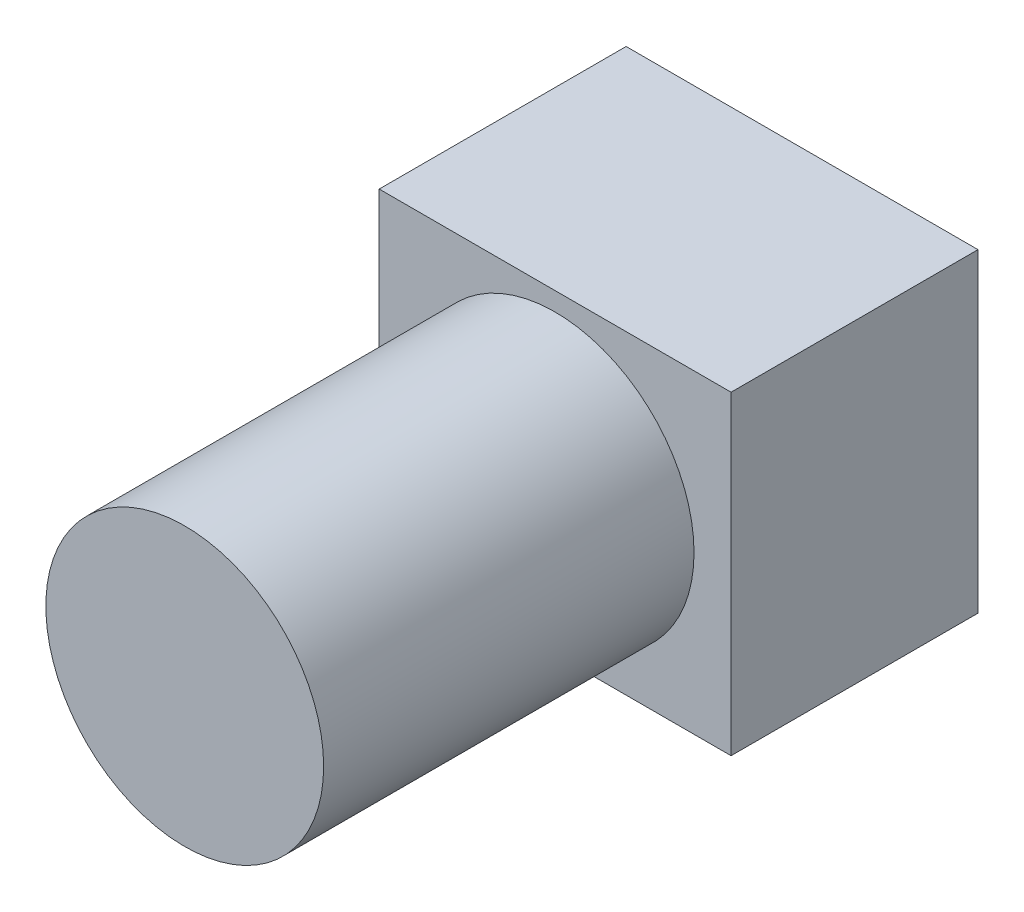
ISO-10303-21;
HEADER;
FILE_DESCRIPTION(('STEP AP214'),'2;1');
FILE_NAME('part.step','',(''),(''),'','','');
FILE_SCHEMA(('AUTOMOTIVE_DESIGN { 1 0 10303 214 1 1 1 1 }'));
ENDSEC;
DATA;
#1=APPLICATION_CONTEXT('core data for automotive mechanical design processes');
#2=APPLICATION_PROTOCOL_DEFINITION('international standard','automotive_design',2000,#1);
#3=PRODUCT_CONTEXT('',#1,'mechanical');
#4=PRODUCT('Part','Part','',(#3));
#5=PRODUCT_RELATED_PRODUCT_CATEGORY('part','',(#4));
#6=PRODUCT_DEFINITION_FORMATION('','',#4);
#7=PRODUCT_DEFINITION_CONTEXT('part definition',#1,'design');
#8=PRODUCT_DEFINITION('design','',#6,#7);
#9=PRODUCT_DEFINITION_SHAPE('','',#8);
#10=(LENGTH_UNIT() NAMED_UNIT(*) SI_UNIT(.MILLI.,.METRE.));
#11=(NAMED_UNIT(*) PLANE_ANGLE_UNIT() SI_UNIT($,.RADIAN.));
#12=(NAMED_UNIT(*) SI_UNIT($,.STERADIAN.) SOLID_ANGLE_UNIT());
#13=UNCERTAINTY_MEASURE_WITH_UNIT(LENGTH_MEASURE(1.E-05),#10,'distance_accuracy_value','');
#14=(GEOMETRIC_REPRESENTATION_CONTEXT(3) GLOBAL_UNCERTAINTY_ASSIGNED_CONTEXT((#13)) GLOBAL_UNIT_ASSIGNED_CONTEXT((#10,
#11,#12)) REPRESENTATION_CONTEXT('',''));
#15=CARTESIAN_POINT('',(0.,0.,0.));
#16=DIRECTION('',(0.,0.,1.));
#17=DIRECTION('',(1.,0.,0.));
#18=AXIS2_PLACEMENT_3D('',#15,#16,#17);
#19=CARTESIAN_POINT('',(0.458787901583167,39.7940471189003,122.003262529889));
#20=DIRECTION('',(-1.,0.,0.));
#21=DIRECTION('',(0.,-1.,0.));
#22=AXIS2_PLACEMENT_3D('',#19,#20,#21);
#23=PLANE('',#22);
#24=DIRECTION('',(0.,-1.,0.));
#25=VECTOR('',#24,1.);
#26=CARTESIAN_POINT('',(0.458787901583167,39.7940471189003,126.003262529889));
#27=LINE('',#26,#25);
#28=CARTESIAN_POINT('',(0.458787901583167,39.7940471189003,126.003262529889));
#29=VERTEX_POINT('',#28);
#30=CARTESIAN_POINT('',(0.458787901583167,34.6940472208443,126.003262529889));
#31=VERTEX_POINT('',#30);
#32=EDGE_CURVE('E146',#29,#31,#27,.T.);
#33=ORIENTED_EDGE('',*,*,#32,.T.);
#34=DIRECTION('',(0.,0.,1.));
#35=VECTOR('',#34,1.);
#36=CARTESIAN_POINT('',(0.458787901583167,34.6940472208443,122.003262529889));
#37=LINE('',#36,#35);
#38=CARTESIAN_POINT('',(0.458787901583167,34.6940472208443,122.003262529889));
#39=VERTEX_POINT('',#38);
#40=EDGE_CURVE('E37',#39,#31,#37,.T.);
#41=ORIENTED_EDGE('',*,*,#40,.F.);
#42=DIRECTION('',(0.,-1.,0.));
#43=VECTOR('',#42,1.);
#44=CARTESIAN_POINT('',(0.458787901583167,39.7940471189003,122.003262529889));
#45=LINE('',#44,#43);
#46=CARTESIAN_POINT('',(0.458787901583167,39.7940471189003,122.003262529889));
#47=VERTEX_POINT('',#46);
#48=EDGE_CURVE('E150',#47,#39,#45,.T.);
#49=ORIENTED_EDGE('',*,*,#48,.F.);
#50=DIRECTION('',(0.,0.,1.));
#51=VECTOR('',#50,1.);
#52=CARTESIAN_POINT('',(0.458787901583167,39.7940471189003,122.003262529889));
#53=LINE('',#52,#51);
#54=EDGE_CURVE('E156',#47,#29,#53,.T.);
#55=ORIENTED_EDGE('',*,*,#54,.T.);
#56=EDGE_LOOP('',(#33,#41,#49,#55));
#57=FACE_BOUND('',#56,.T.);
#58=ADVANCED_FACE('F34',(#57),#23,.F.);
#59=CARTESIAN_POINT('',(0.458787901583167,34.6940472208443,122.003262529889));
#60=DIRECTION('',(0.,1.,0.));
#61=DIRECTION('',(0.,0.,1.));
#62=AXIS2_PLACEMENT_3D('',#59,#60,#61);
#63=PLANE('',#62);
#64=DIRECTION('',(-1.,0.,0.));
#65=VECTOR('',#64,1.);
#66=CARTESIAN_POINT('',(0.458787901583167,34.6940472208443,126.003262529889));
#67=LINE('',#66,#65);
#68=CARTESIAN_POINT('',(-5.24121197674083,34.6940472208443,126.003262529889));
#69=VERTEX_POINT('',#68);
#70=EDGE_CURVE('E159',#31,#69,#67,.T.);
#71=ORIENTED_EDGE('',*,*,#70,.T.);
#72=DIRECTION('',(0.,0.,1.));
#73=VECTOR('',#72,1.);
#74=CARTESIAN_POINT('',(-5.24121197674083,34.6940472208443,122.003262529889));
#75=LINE('',#74,#73);
#76=CARTESIAN_POINT('',(-5.24121197674083,34.6940472208443,122.003262529889));
#77=VERTEX_POINT('',#76);
#78=EDGE_CURVE('E166',#77,#69,#75,.T.);
#79=ORIENTED_EDGE('',*,*,#78,.F.);
#80=DIRECTION('',(-1.,0.,0.));
#81=VECTOR('',#80,1.);
#82=CARTESIAN_POINT('',(0.458787901583167,34.6940472208443,122.003262529889));
#83=LINE('',#82,#81);
#84=EDGE_CURVE('E87',#39,#77,#83,.T.);
#85=ORIENTED_EDGE('',*,*,#84,.F.);
#86=ORIENTED_EDGE('',*,*,#40,.T.);
#87=EDGE_LOOP('',(#71,#79,#85,#86));
#88=FACE_BOUND('',#87,.T.);
#89=ADVANCED_FACE('F172',(#88),#63,.F.);
#90=CARTESIAN_POINT('',(-5.24121197674083,39.7940471189003,122.003262529889));
#91=DIRECTION('',(1.,0.,0.));
#92=DIRECTION('',(0.,1.,0.));
#93=AXIS2_PLACEMENT_3D('',#90,#91,#92);
#94=PLANE('',#93);
#95=DIRECTION('',(0.,1.,0.));
#96=VECTOR('',#95,1.);
#97=CARTESIAN_POINT('',(-5.24121197674083,39.7940471189003,126.003262529889));
#98=LINE('',#97,#96);
#99=CARTESIAN_POINT('',(-5.24121197674083,39.7940471189003,126.003262529889));
#100=VERTEX_POINT('',#99);
#101=EDGE_CURVE('E161',#69,#100,#98,.T.);
#102=ORIENTED_EDGE('',*,*,#101,.T.);
#103=DIRECTION('',(0.,0.,1.));
#104=VECTOR('',#103,1.);
#105=CARTESIAN_POINT('',(-5.24121197674083,39.7940471189003,122.003262529889));
#106=LINE('',#105,#104);
#107=CARTESIAN_POINT('',(-5.24121197674083,39.7940471189003,122.003262529889));
#108=VERTEX_POINT('',#107);
#109=EDGE_CURVE('E165',#108,#100,#106,.T.);
#110=ORIENTED_EDGE('',*,*,#109,.F.);
#111=DIRECTION('',(0.,1.,0.));
#112=VECTOR('',#111,1.);
#113=CARTESIAN_POINT('',(-5.24121197674083,39.7940471189003,122.003262529889));
#114=LINE('',#113,#112);
#115=EDGE_CURVE('E153',#77,#108,#114,.T.);
#116=ORIENTED_EDGE('',*,*,#115,.F.);
#117=ORIENTED_EDGE('',*,*,#78,.T.);
#118=EDGE_LOOP('',(#102,#110,#116,#117));
#119=FACE_BOUND('',#118,.T.);
#120=ADVANCED_FACE('F179',(#119),#94,.F.);
#121=CARTESIAN_POINT('',(0.458787901583167,39.7940471189003,122.003262529889));
#122=DIRECTION('',(0.,-1.,0.));
#123=DIRECTION('',(0.,0.,-1.));
#124=AXIS2_PLACEMENT_3D('',#121,#122,#123);
#125=PLANE('',#124);
#126=DIRECTION('',(1.,0.,0.));
#127=VECTOR('',#126,1.);
#128=CARTESIAN_POINT('',(0.458787901583167,39.7940471189003,126.003262529889));
#129=LINE('',#128,#127);
#130=EDGE_CURVE('E79',#100,#29,#129,.T.);
#131=ORIENTED_EDGE('',*,*,#130,.T.);
#132=ORIENTED_EDGE('',*,*,#54,.F.);
#133=DIRECTION('',(1.,0.,0.));
#134=VECTOR('',#133,1.);
#135=CARTESIAN_POINT('',(0.458787901583167,39.7940471189003,122.003262529889));
#136=LINE('',#135,#134);
#137=EDGE_CURVE('E58',#108,#47,#136,.T.);
#138=ORIENTED_EDGE('',*,*,#137,.F.);
#139=ORIENTED_EDGE('',*,*,#109,.T.);
#140=EDGE_LOOP('',(#131,#132,#138,#139));
#141=FACE_BOUND('',#140,.T.);
#142=ADVANCED_FACE('F180',(#141),#125,.F.);
#143=CARTESIAN_POINT('',(0.,0.,122.003262529889));
#144=DIRECTION('',(0.,0.,-1.));
#145=DIRECTION('',(-1.,0.,0.));
#146=AXIS2_PLACEMENT_3D('',#143,#144,#145);
#147=PLANE('',#146);
#148=DIRECTION('',(0.,-1.,0.));
#149=VECTOR('',#148,1.);
#150=CARTESIAN_POINT('',(-0.391212098416833,39.2440471189003,122.003262529889));
#151=LINE('',#150,#149);
#152=CARTESIAN_POINT('',(-0.391212098416833,39.2440471189003,122.003262529889));
#153=VERTEX_POINT('',#152);
#154=CARTESIAN_POINT('',(-0.391212098416833,35.2440471189003,122.003262529889));
#155=VERTEX_POINT('',#154);
#156=EDGE_CURVE('E49',#153,#155,#151,.T.);
#157=ORIENTED_EDGE('',*,*,#156,.F.);
#158=DIRECTION('',(1.,0.,0.));
#159=VECTOR('',#158,1.);
#160=CARTESIAN_POINT('',(-0.391212098416833,39.2440471189003,122.003262529889));
#161=LINE('',#160,#159);
#162=CARTESIAN_POINT('',(-4.39121209841683,39.2440471189003,122.003262529889));
#163=VERTEX_POINT('',#162);
#164=EDGE_CURVE('E129',#163,#153,#161,.T.);
#165=ORIENTED_EDGE('',*,*,#164,.F.);
#166=DIRECTION('',(0.,1.,0.));
#167=VECTOR('',#166,1.);
#168=CARTESIAN_POINT('',(-4.39121209841683,39.2440471189003,122.003262529889));
#169=LINE('',#168,#167);
#170=CARTESIAN_POINT('',(-4.39121209841683,35.2440471189003,122.003262529889));
#171=VERTEX_POINT('',#170);
#172=EDGE_CURVE('E132',#171,#163,#169,.T.);
#173=ORIENTED_EDGE('',*,*,#172,.F.);
#174=DIRECTION('',(-1.,0.,0.));
#175=VECTOR('',#174,1.);
#176=CARTESIAN_POINT('',(-0.391212098416833,35.2440471189003,122.003262529889));
#177=LINE('',#176,#175);
#178=EDGE_CURVE('E139',#155,#171,#177,.T.);
#179=ORIENTED_EDGE('',*,*,#178,.F.);
#180=EDGE_LOOP('',(#157,#165,#173,#179));
#181=FACE_BOUND('',#180,.T.);
#182=ORIENTED_EDGE('',*,*,#48,.T.);
#183=ORIENTED_EDGE('',*,*,#84,.T.);
#184=ORIENTED_EDGE('',*,*,#115,.T.);
#185=ORIENTED_EDGE('',*,*,#137,.T.);
#186=EDGE_LOOP('',(#182,#183,#184,#185));
#187=FACE_BOUND('',#186,.T.);
#188=ADVANCED_FACE('F181',(#181,#187),#147,.T.);
#189=CARTESIAN_POINT('',(0.,0.,126.003262529889));
#190=DIRECTION('',(0.,0.,-1.));
#191=DIRECTION('',(-1.,0.,0.));
#192=AXIS2_PLACEMENT_3D('',#189,#190,#191);
#193=PLANE('',#192);
#194=CARTESIAN_POINT('',(-2.39121203757883,37.2440471698723,126.003262529889));
#195=DIRECTION('',(0.,0.,1.));
#196=DIRECTION('',(1.,0.,0.));
#197=AXIS2_PLACEMENT_3D('',#194,#195,#196);
#198=CIRCLE('',#197,2.25);
#199=CARTESIAN_POINT('',(-0.141212037578832,37.2440471698723,126.003262529889));
#200=VERTEX_POINT('',#199);
#201=EDGE_CURVE('E11',#200,#200,#198,.T.);
#202=ORIENTED_EDGE('',*,*,#201,.F.);
#203=EDGE_LOOP('',(#202));
#204=FACE_BOUND('',#203,.T.);
#205=ORIENTED_EDGE('',*,*,#32,.F.);
#206=ORIENTED_EDGE('',*,*,#130,.F.);
#207=ORIENTED_EDGE('',*,*,#101,.F.);
#208=ORIENTED_EDGE('',*,*,#70,.F.);
#209=EDGE_LOOP('',(#205,#206,#207,#208));
#210=FACE_BOUND('',#209,.T.);
#211=ADVANCED_FACE('F177',(#204,#210),#193,.F.);
#212=CARTESIAN_POINT('',(-0.391212098416833,39.2440471189003,123.003262529889));
#213=DIRECTION('',(1.,0.,0.));
#214=DIRECTION('',(0.,1.,0.));
#215=AXIS2_PLACEMENT_3D('',#212,#213,#214);
#216=PLANE('',#215);
#217=ORIENTED_EDGE('',*,*,#156,.T.);
#218=DIRECTION('',(0.,0.,-1.));
#219=VECTOR('',#218,1.);
#220=CARTESIAN_POINT('',(-0.391212098416833,35.2440471189003,123.003262529889));
#221=LINE('',#220,#219);
#222=CARTESIAN_POINT('',(-0.391212098416833,35.2440471189003,123.003262529889));
#223=VERTEX_POINT('',#222);
#224=EDGE_CURVE('E107',#223,#155,#221,.T.);
#225=ORIENTED_EDGE('',*,*,#224,.F.);
#226=DIRECTION('',(0.,-1.,0.));
#227=VECTOR('',#226,1.);
#228=CARTESIAN_POINT('',(-0.391212098416833,39.2440471189003,123.003262529889));
#229=LINE('',#228,#227);
#230=CARTESIAN_POINT('',(-0.391212098416833,39.2440471189003,123.003262529889));
#231=VERTEX_POINT('',#230);
#232=EDGE_CURVE('E111',#231,#223,#229,.T.);
#233=ORIENTED_EDGE('',*,*,#232,.F.);
#234=DIRECTION('',(0.,0.,-1.));
#235=VECTOR('',#234,1.);
#236=CARTESIAN_POINT('',(-0.391212098416833,39.2440471189003,123.003262529889));
#237=LINE('',#236,#235);
#238=EDGE_CURVE('E144',#231,#153,#237,.T.);
#239=ORIENTED_EDGE('',*,*,#238,.T.);
#240=EDGE_LOOP('',(#217,#225,#233,#239));
#241=FACE_BOUND('',#240,.T.);
#242=ADVANCED_FACE('F109',(#241),#216,.F.);
#243=CARTESIAN_POINT('',(-0.391212098416833,39.2440471189003,123.003262529889));
#244=DIRECTION('',(0.,1.,0.));
#245=DIRECTION('',(0.,0.,1.));
#246=AXIS2_PLACEMENT_3D('',#243,#244,#245);
#247=PLANE('',#246);
#248=ORIENTED_EDGE('',*,*,#164,.T.);
#249=ORIENTED_EDGE('',*,*,#238,.F.);
#250=DIRECTION('',(1.,0.,0.));
#251=VECTOR('',#250,1.);
#252=CARTESIAN_POINT('',(-0.391212098416833,39.2440471189003,123.003262529889));
#253=LINE('',#252,#251);
#254=CARTESIAN_POINT('',(-4.39121209841683,39.2440471189003,123.003262529889));
#255=VERTEX_POINT('',#254);
#256=EDGE_CURVE('E117',#255,#231,#253,.T.);
#257=ORIENTED_EDGE('',*,*,#256,.F.);
#258=DIRECTION('',(0.,0.,-1.));
#259=VECTOR('',#258,1.);
#260=CARTESIAN_POINT('',(-4.39121209841683,39.2440471189003,123.003262529889));
#261=LINE('',#260,#259);
#262=EDGE_CURVE('E147',#255,#163,#261,.T.);
#263=ORIENTED_EDGE('',*,*,#262,.T.);
#264=EDGE_LOOP('',(#248,#249,#257,#263));
#265=FACE_BOUND('',#264,.T.);
#266=ADVANCED_FACE('F221',(#265),#247,.F.);
#267=CARTESIAN_POINT('',(-4.39121209841683,39.2440471189003,123.003262529889));
#268=DIRECTION('',(-1.,0.,0.));
#269=DIRECTION('',(0.,0.,1.));
#270=AXIS2_PLACEMENT_3D('',#267,#268,#269);
#271=PLANE('',#270);
#272=ORIENTED_EDGE('',*,*,#172,.T.);
#273=ORIENTED_EDGE('',*,*,#262,.F.);
#274=DIRECTION('',(0.,1.,0.));
#275=VECTOR('',#274,1.);
#276=CARTESIAN_POINT('',(-4.39121209841683,39.2440471189003,123.003262529889));
#277=LINE('',#276,#275);
#278=CARTESIAN_POINT('',(-4.39121209841683,35.2440471189003,123.003262529889));
#279=VERTEX_POINT('',#278);
#280=EDGE_CURVE('E125',#279,#255,#277,.T.);
#281=ORIENTED_EDGE('',*,*,#280,.F.);
#282=DIRECTION('',(0.,0.,-1.));
#283=VECTOR('',#282,1.);
#284=CARTESIAN_POINT('',(-4.39121209841683,35.2440471189003,123.003262529889));
#285=LINE('',#284,#283);
#286=EDGE_CURVE('E116',#279,#171,#285,.T.);
#287=ORIENTED_EDGE('',*,*,#286,.T.);
#288=EDGE_LOOP('',(#272,#273,#281,#287));
#289=FACE_BOUND('',#288,.T.);
#290=ADVANCED_FACE('F229',(#289),#271,.F.);
#291=CARTESIAN_POINT('',(-0.391212098416833,35.2440471189003,123.003262529889));
#292=DIRECTION('',(0.,-1.,0.));
#293=DIRECTION('',(0.,0.,-1.));
#294=AXIS2_PLACEMENT_3D('',#291,#292,#293);
#295=PLANE('',#294);
#296=ORIENTED_EDGE('',*,*,#178,.T.);
#297=ORIENTED_EDGE('',*,*,#286,.F.);
#298=DIRECTION('',(-1.,0.,0.));
#299=VECTOR('',#298,1.);
#300=CARTESIAN_POINT('',(-0.391212098416833,35.2440471189003,123.003262529889));
#301=LINE('',#300,#299);
#302=EDGE_CURVE('E120',#223,#279,#301,.T.);
#303=ORIENTED_EDGE('',*,*,#302,.F.);
#304=ORIENTED_EDGE('',*,*,#224,.T.);
#305=EDGE_LOOP('',(#296,#297,#303,#304));
#306=FACE_BOUND('',#305,.T.);
#307=ADVANCED_FACE('F121',(#306),#295,.F.);
#308=CARTESIAN_POINT('',(0.,0.,123.003262529889));
#309=DIRECTION('',(0.,0.,-1.));
#310=DIRECTION('',(-1.,0.,0.));
#311=AXIS2_PLACEMENT_3D('',#308,#309,#310);
#312=PLANE('',#311);
#313=ORIENTED_EDGE('',*,*,#232,.T.);
#314=ORIENTED_EDGE('',*,*,#302,.T.);
#315=ORIENTED_EDGE('',*,*,#280,.T.);
#316=ORIENTED_EDGE('',*,*,#256,.T.);
#317=EDGE_LOOP('',(#313,#314,#315,#316));
#318=FACE_BOUND('',#317,.T.);
#319=ADVANCED_FACE('F127',(#318),#312,.T.);
#320=CARTESIAN_POINT('',(-2.39121203757883,37.2440471698723,132.003262529889));
#321=DIRECTION('',(0.,0.,-1.));
#322=DIRECTION('',(-1.,0.,0.));
#323=AXIS2_PLACEMENT_3D('',#320,#321,#322);
#324=CYLINDRICAL_SURFACE('',#323,2.25);
#325=CARTESIAN_POINT('',(-2.39121203757883,37.2440471698723,132.003262529889));
#326=DIRECTION('',(0.,0.,1.));
#327=DIRECTION('',(1.,0.,0.));
#328=AXIS2_PLACEMENT_3D('',#325,#326,#327);
#329=CIRCLE('',#328,2.25);
#330=CARTESIAN_POINT('',(-0.141212037578832,37.2440471698723,132.003262529889));
#331=VERTEX_POINT('',#330);
#332=EDGE_CURVE('E140',#331,#331,#329,.T.);
#333=ORIENTED_EDGE('',*,*,#332,.F.);
#334=EDGE_LOOP('',(#333));
#335=FACE_BOUND('',#334,.T.);
#336=ORIENTED_EDGE('',*,*,#201,.T.);
#337=EDGE_LOOP('',(#336));
#338=FACE_BOUND('',#337,.T.);
#339=ADVANCED_FACE('F256',(#335,#338),#324,.T.);
#340=CARTESIAN_POINT('',(-2.39121203757883,37.2440471698723,132.003262529889));
#341=DIRECTION('',(0.,0.,1.));
#342=DIRECTION('',(1.,0.,0.));
#343=AXIS2_PLACEMENT_3D('',#340,#341,#342);
#344=PLANE('',#343);
#345=ORIENTED_EDGE('',*,*,#332,.T.);
#346=EDGE_LOOP('',(#345));
#347=FACE_BOUND('',#346,.T.);
#348=ADVANCED_FACE('F270',(#347),#344,.T.);
#349=CLOSED_SHELL('',(#58,#89,#120,#142,#188,#211,#242,#266,#290,#307,#319,#339,#348));
#350=MANIFOLD_SOLID_BREP('B2',#349);
#351=ADVANCED_BREP_SHAPE_REPRESENTATION('',(#18,#350),#14);
#352=SHAPE_DEFINITION_REPRESENTATION(#9,#351);
ENDSEC;
END-ISO-10303-21;
